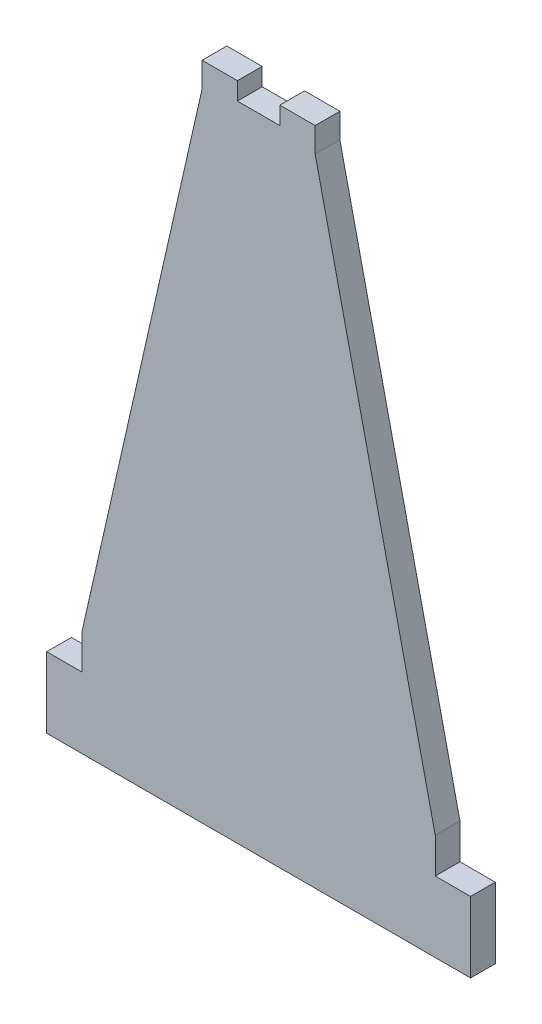
ISO-10303-21;
HEADER;
FILE_DESCRIPTION(('STEP AP214'),'2;1');
FILE_NAME('part.step','',(''),(''),'','','');
FILE_SCHEMA(('AUTOMOTIVE_DESIGN { 1 0 10303 214 1 1 1 1 }'));
ENDSEC;
DATA;
#1=APPLICATION_CONTEXT('core data for automotive mechanical design processes');
#2=APPLICATION_PROTOCOL_DEFINITION('international standard','automotive_design',2000,#1);
#3=PRODUCT_CONTEXT('',#1,'mechanical');
#4=PRODUCT('Part','Part','',(#3));
#5=PRODUCT_RELATED_PRODUCT_CATEGORY('part','',(#4));
#6=PRODUCT_DEFINITION_FORMATION('','',#4);
#7=PRODUCT_DEFINITION_CONTEXT('part definition',#1,'design');
#8=PRODUCT_DEFINITION('design','',#6,#7);
#9=PRODUCT_DEFINITION_SHAPE('','',#8);
#10=(LENGTH_UNIT() NAMED_UNIT(*) SI_UNIT(.MILLI.,.METRE.));
#11=(NAMED_UNIT(*) PLANE_ANGLE_UNIT() SI_UNIT($,.RADIAN.));
#12=(NAMED_UNIT(*) SI_UNIT($,.STERADIAN.) SOLID_ANGLE_UNIT());
#13=UNCERTAINTY_MEASURE_WITH_UNIT(LENGTH_MEASURE(1.E-05),#10,'distance_accuracy_value','');
#14=(GEOMETRIC_REPRESENTATION_CONTEXT(3) GLOBAL_UNCERTAINTY_ASSIGNED_CONTEXT((#13)) GLOBAL_UNIT_ASSIGNED_CONTEXT((#10,
#11,#12)) REPRESENTATION_CONTEXT('',''));
#15=CARTESIAN_POINT('',(0.,0.,0.));
#16=DIRECTION('',(0.,0.,1.));
#17=DIRECTION('',(1.,0.,0.));
#18=AXIS2_PLACEMENT_3D('',#15,#16,#17);
#19=CARTESIAN_POINT('',(0.,1.,0.175));
#20=DIRECTION('',(1.,0.,0.));
#21=DIRECTION('',(0.,1.,0.));
#22=AXIS2_PLACEMENT_3D('',#19,#20,#21);
#23=PLANE('',#22);
#24=DIRECTION('',(0.,-1.,0.));
#25=VECTOR('',#24,1.);
#26=CARTESIAN_POINT('',(0.,1.,-0.175));
#27=LINE('',#26,#25);
#28=CARTESIAN_POINT('',(0.,1.,-0.175));
#29=VERTEX_POINT('',#28);
#30=CARTESIAN_POINT('',(0.,0.,-0.175));
#31=VERTEX_POINT('',#30);
#32=EDGE_CURVE('E205',#29,#31,#27,.T.);
#33=ORIENTED_EDGE('',*,*,#32,.T.);
#34=DIRECTION('',(0.,0.,-1.));
#35=VECTOR('',#34,1.);
#36=CARTESIAN_POINT('',(0.,0.,0.175));
#37=LINE('',#36,#35);
#38=CARTESIAN_POINT('',(0.,0.,0.175));
#39=VERTEX_POINT('',#38);
#40=EDGE_CURVE('E11',#39,#31,#37,.T.);
#41=ORIENTED_EDGE('',*,*,#40,.F.);
#42=DIRECTION('',(0.,-1.,0.));
#43=VECTOR('',#42,1.);
#44=CARTESIAN_POINT('',(0.,1.,0.175));
#45=LINE('',#44,#43);
#46=CARTESIAN_POINT('',(0.,1.,0.175));
#47=VERTEX_POINT('',#46);
#48=EDGE_CURVE('E243',#47,#39,#45,.T.);
#49=ORIENTED_EDGE('',*,*,#48,.F.);
#50=DIRECTION('',(0.,0.,-1.));
#51=VECTOR('',#50,1.);
#52=CARTESIAN_POINT('',(0.,1.,0.175));
#53=LINE('',#52,#51);
#54=EDGE_CURVE('E201',#47,#29,#53,.T.);
#55=ORIENTED_EDGE('',*,*,#54,.T.);
#56=EDGE_LOOP('',(#33,#41,#49,#55));
#57=FACE_BOUND('',#56,.T.);
#58=ADVANCED_FACE('F39',(#57),#23,.F.);
#59=CARTESIAN_POINT('',(0.,0.,0.175));
#60=DIRECTION('',(0.,1.,0.));
#61=DIRECTION('',(0.,0.,1.));
#62=AXIS2_PLACEMENT_3D('',#59,#60,#61);
#63=PLANE('',#62);
#64=DIRECTION('',(1.,0.,0.));
#65=VECTOR('',#64,1.);
#66=CARTESIAN_POINT('',(0.,0.,-0.175));
#67=LINE('',#66,#65);
#68=CARTESIAN_POINT('',(6.,0.,-0.175));
#69=VERTEX_POINT('',#68);
#70=EDGE_CURVE('E209',#31,#69,#67,.T.);
#71=ORIENTED_EDGE('',*,*,#70,.T.);
#72=DIRECTION('',(0.,0.,-1.));
#73=VECTOR('',#72,1.);
#74=CARTESIAN_POINT('',(6.,0.,0.175));
#75=LINE('',#74,#73);
#76=CARTESIAN_POINT('',(6.,0.,0.175));
#77=VERTEX_POINT('',#76);
#78=EDGE_CURVE('E48',#77,#69,#75,.T.);
#79=ORIENTED_EDGE('',*,*,#78,.F.);
#80=DIRECTION('',(1.,0.,0.));
#81=VECTOR('',#80,1.);
#82=CARTESIAN_POINT('',(0.,0.,0.175));
#83=LINE('',#82,#81);
#84=EDGE_CURVE('E135',#39,#77,#83,.T.);
#85=ORIENTED_EDGE('',*,*,#84,.F.);
#86=ORIENTED_EDGE('',*,*,#40,.T.);
#87=EDGE_LOOP('',(#71,#79,#85,#86));
#88=FACE_BOUND('',#87,.T.);
#89=ADVANCED_FACE('F351',(#88),#63,.F.);
#90=CARTESIAN_POINT('',(6.,0.,0.175));
#91=DIRECTION('',(-1.,0.,0.));
#92=DIRECTION('',(0.,-1.,0.));
#93=AXIS2_PLACEMENT_3D('',#90,#91,#92);
#94=PLANE('',#93);
#95=DIRECTION('',(0.,1.,0.));
#96=VECTOR('',#95,1.);
#97=CARTESIAN_POINT('',(6.,0.,-0.175));
#98=LINE('',#97,#96);
#99=CARTESIAN_POINT('',(6.,1.,-0.175));
#100=VERTEX_POINT('',#99);
#101=EDGE_CURVE('E212',#69,#100,#98,.T.);
#102=ORIENTED_EDGE('',*,*,#101,.T.);
#103=DIRECTION('',(0.,0.,-1.));
#104=VECTOR('',#103,1.);
#105=CARTESIAN_POINT('',(6.,1.,0.175));
#106=LINE('',#105,#104);
#107=CARTESIAN_POINT('',(6.,1.,0.175));
#108=VERTEX_POINT('',#107);
#109=EDGE_CURVE('E278',#108,#100,#106,.T.);
#110=ORIENTED_EDGE('',*,*,#109,.F.);
#111=DIRECTION('',(0.,1.,0.));
#112=VECTOR('',#111,1.);
#113=CARTESIAN_POINT('',(6.,0.,0.175));
#114=LINE('',#113,#112);
#115=EDGE_CURVE('E289',#77,#108,#114,.T.);
#116=ORIENTED_EDGE('',*,*,#115,.F.);
#117=ORIENTED_EDGE('',*,*,#78,.T.);
#118=EDGE_LOOP('',(#102,#110,#116,#117));
#119=FACE_BOUND('',#118,.T.);
#120=ADVANCED_FACE('F287',(#119),#94,.F.);
#121=CARTESIAN_POINT('',(6.,1.,0.175));
#122=DIRECTION('',(0.,-1.,0.));
#123=DIRECTION('',(1.,0.,0.));
#124=AXIS2_PLACEMENT_3D('',#121,#122,#123);
#125=PLANE('',#124);
#126=DIRECTION('',(-1.,0.,0.));
#127=VECTOR('',#126,1.);
#128=CARTESIAN_POINT('',(6.,1.,-0.175));
#129=LINE('',#128,#127);
#130=CARTESIAN_POINT('',(5.5,1.,-0.175));
#131=VERTEX_POINT('',#130);
#132=EDGE_CURVE('E215',#100,#131,#129,.T.);
#133=ORIENTED_EDGE('',*,*,#132,.T.);
#134=DIRECTION('',(0.,0.,-1.));
#135=VECTOR('',#134,1.);
#136=CARTESIAN_POINT('',(5.5,1.,0.175));
#137=LINE('',#136,#135);
#138=CARTESIAN_POINT('',(5.5,1.,0.175));
#139=VERTEX_POINT('',#138);
#140=EDGE_CURVE('E274',#139,#131,#137,.T.);
#141=ORIENTED_EDGE('',*,*,#140,.F.);
#142=DIRECTION('',(-1.,0.,0.));
#143=VECTOR('',#142,1.);
#144=CARTESIAN_POINT('',(6.,1.,0.175));
#145=LINE('',#144,#143);
#146=EDGE_CURVE('E308',#108,#139,#145,.T.);
#147=ORIENTED_EDGE('',*,*,#146,.F.);
#148=ORIENTED_EDGE('',*,*,#109,.T.);
#149=EDGE_LOOP('',(#133,#141,#147,#148));
#150=FACE_BOUND('',#149,.T.);
#151=ADVANCED_FACE('F298',(#150),#125,.F.);
#152=CARTESIAN_POINT('',(5.5,1.,0.175));
#153=DIRECTION('',(-1.,0.,0.));
#154=DIRECTION('',(0.,-1.,0.));
#155=AXIS2_PLACEMENT_3D('',#152,#153,#154);
#156=PLANE('',#155);
#157=DIRECTION('',(0.,1.,0.));
#158=VECTOR('',#157,1.);
#159=CARTESIAN_POINT('',(5.5,1.,-0.175));
#160=LINE('',#159,#158);
#161=CARTESIAN_POINT('',(5.5,1.5,-0.175));
#162=VERTEX_POINT('',#161);
#163=EDGE_CURVE('E218',#131,#162,#160,.T.);
#164=ORIENTED_EDGE('',*,*,#163,.T.);
#165=DIRECTION('',(0.,0.,-1.));
#166=VECTOR('',#165,1.);
#167=CARTESIAN_POINT('',(5.5,1.5,0.175));
#168=LINE('',#167,#166);
#169=CARTESIAN_POINT('',(5.5,1.5,0.175));
#170=VERTEX_POINT('',#169);
#171=EDGE_CURVE('E270',#170,#162,#168,.T.);
#172=ORIENTED_EDGE('',*,*,#171,.F.);
#173=DIRECTION('',(0.,1.,0.));
#174=VECTOR('',#173,1.);
#175=CARTESIAN_POINT('',(5.5,1.,0.175));
#176=LINE('',#175,#174);
#177=EDGE_CURVE('E304',#139,#170,#176,.T.);
#178=ORIENTED_EDGE('',*,*,#177,.F.);
#179=ORIENTED_EDGE('',*,*,#140,.T.);
#180=EDGE_LOOP('',(#164,#172,#178,#179));
#181=FACE_BOUND('',#180,.T.);
#182=ADVANCED_FACE('F302',(#181),#156,.F.);
#183=CARTESIAN_POINT('',(5.5,1.5,0.175));
#184=DIRECTION('',(-0.97526042930658,-0.221059030642825,0.));
#185=DIRECTION('',(0.221059030642825,-0.97526042930658,0.));
#186=AXIS2_PLACEMENT_3D('',#183,#184,#185);
#187=PLANE('',#186);
#188=DIRECTION('',(-0.221059030642825,0.97526042930658,0.));
#189=VECTOR('',#188,1.);
#190=CARTESIAN_POINT('',(5.5,1.5,-0.175));
#191=LINE('',#190,#189);
#192=CARTESIAN_POINT('',(3.8,9.,-0.175));
#193=VERTEX_POINT('',#192);
#194=EDGE_CURVE('E221',#162,#193,#191,.T.);
#195=ORIENTED_EDGE('',*,*,#194,.T.);
#196=DIRECTION('',(0.,0.,-1.));
#197=VECTOR('',#196,1.);
#198=CARTESIAN_POINT('',(3.8,9.,0.175));
#199=LINE('',#198,#197);
#200=CARTESIAN_POINT('',(3.8,9.,0.175));
#201=VERTEX_POINT('',#200);
#202=EDGE_CURVE('E267',#201,#193,#199,.T.);
#203=ORIENTED_EDGE('',*,*,#202,.F.);
#204=DIRECTION('',(-0.221059030642825,0.97526042930658,0.));
#205=VECTOR('',#204,1.);
#206=CARTESIAN_POINT('',(5.5,1.5,0.175));
#207=LINE('',#206,#205);
#208=EDGE_CURVE('E307',#170,#201,#207,.T.);
#209=ORIENTED_EDGE('',*,*,#208,.F.);
#210=ORIENTED_EDGE('',*,*,#171,.T.);
#211=EDGE_LOOP('',(#195,#203,#209,#210));
#212=FACE_BOUND('',#211,.T.);
#213=ADVANCED_FACE('F364',(#212),#187,.F.);
#214=CARTESIAN_POINT('',(3.8,9.,0.175));
#215=DIRECTION('',(-1.,0.,0.));
#216=DIRECTION('',(0.,0.,1.));
#217=AXIS2_PLACEMENT_3D('',#214,#215,#216);
#218=PLANE('',#217);
#219=DIRECTION('',(0.,1.,0.));
#220=VECTOR('',#219,1.);
#221=CARTESIAN_POINT('',(3.8,9.,-0.175));
#222=LINE('',#221,#220);
#223=CARTESIAN_POINT('',(3.8,9.35,-0.175));
#224=VERTEX_POINT('',#223);
#225=EDGE_CURVE('E224',#193,#224,#222,.T.);
#226=ORIENTED_EDGE('',*,*,#225,.T.);
#227=DIRECTION('',(0.,0.,-1.));
#228=VECTOR('',#227,1.);
#229=CARTESIAN_POINT('',(3.8,9.35,0.175));
#230=LINE('',#229,#228);
#231=CARTESIAN_POINT('',(3.8,9.35,0.175));
#232=VERTEX_POINT('',#231);
#233=EDGE_CURVE('E264',#232,#224,#230,.T.);
#234=ORIENTED_EDGE('',*,*,#233,.F.);
#235=DIRECTION('',(0.,1.,0.));
#236=VECTOR('',#235,1.);
#237=CARTESIAN_POINT('',(3.8,9.,0.175));
#238=LINE('',#237,#236);
#239=EDGE_CURVE('E311',#201,#232,#238,.T.);
#240=ORIENTED_EDGE('',*,*,#239,.F.);
#241=ORIENTED_EDGE('',*,*,#202,.T.);
#242=EDGE_LOOP('',(#226,#234,#240,#241));
#243=FACE_BOUND('',#242,.T.);
#244=ADVANCED_FACE('F367',(#243),#218,.F.);
#245=CARTESIAN_POINT('',(3.8,9.35,0.175));
#246=DIRECTION('',(0.,-1.,0.));
#247=DIRECTION('',(0.,0.,-1.));
#248=AXIS2_PLACEMENT_3D('',#245,#246,#247);
#249=PLANE('',#248);
#250=DIRECTION('',(-1.,0.,0.));
#251=VECTOR('',#250,1.);
#252=CARTESIAN_POINT('',(3.8,9.35,-0.175));
#253=LINE('',#252,#251);
#254=CARTESIAN_POINT('',(3.3,9.35,-0.175));
#255=VERTEX_POINT('',#254);
#256=EDGE_CURVE('E226',#224,#255,#253,.T.);
#257=ORIENTED_EDGE('',*,*,#256,.T.);
#258=DIRECTION('',(0.,0.,-1.));
#259=VECTOR('',#258,1.);
#260=CARTESIAN_POINT('',(3.3,9.35,0.175));
#261=LINE('',#260,#259);
#262=CARTESIAN_POINT('',(3.3,9.35,0.175));
#263=VERTEX_POINT('',#262);
#264=EDGE_CURVE('E261',#263,#255,#261,.T.);
#265=ORIENTED_EDGE('',*,*,#264,.F.);
#266=DIRECTION('',(-1.,0.,0.));
#267=VECTOR('',#266,1.);
#268=CARTESIAN_POINT('',(3.8,9.35,0.175));
#269=LINE('',#268,#267);
#270=EDGE_CURVE('E318',#232,#263,#269,.T.);
#271=ORIENTED_EDGE('',*,*,#270,.F.);
#272=ORIENTED_EDGE('',*,*,#233,.T.);
#273=EDGE_LOOP('',(#257,#265,#271,#272));
#274=FACE_BOUND('',#273,.T.);
#275=ADVANCED_FACE('F371',(#274),#249,.F.);
#276=CARTESIAN_POINT('',(3.3,9.35,0.175));
#277=DIRECTION('',(1.,0.,0.));
#278=DIRECTION('',(0.,1.,0.));
#279=AXIS2_PLACEMENT_3D('',#276,#277,#278);
#280=PLANE('',#279);
#281=DIRECTION('',(0.,-1.,0.));
#282=VECTOR('',#281,1.);
#283=CARTESIAN_POINT('',(3.3,9.35,-0.175));
#284=LINE('',#283,#282);
#285=CARTESIAN_POINT('',(3.3,9.1,-0.175));
#286=VERTEX_POINT('',#285);
#287=EDGE_CURVE('E228',#255,#286,#284,.T.);
#288=ORIENTED_EDGE('',*,*,#287,.T.);
#289=DIRECTION('',(0.,0.,-1.));
#290=VECTOR('',#289,1.);
#291=CARTESIAN_POINT('',(3.3,9.1,0.175));
#292=LINE('',#291,#290);
#293=CARTESIAN_POINT('',(3.3,9.1,0.175));
#294=VERTEX_POINT('',#293);
#295=EDGE_CURVE('E258',#294,#286,#292,.T.);
#296=ORIENTED_EDGE('',*,*,#295,.F.);
#297=DIRECTION('',(0.,-1.,0.));
#298=VECTOR('',#297,1.);
#299=CARTESIAN_POINT('',(3.3,9.35,0.175));
#300=LINE('',#299,#298);
#301=EDGE_CURVE('E320',#263,#294,#300,.T.);
#302=ORIENTED_EDGE('',*,*,#301,.F.);
#303=ORIENTED_EDGE('',*,*,#264,.T.);
#304=EDGE_LOOP('',(#288,#296,#302,#303));
#305=FACE_BOUND('',#304,.T.);
#306=ADVANCED_FACE('F375',(#305),#280,.F.);
#307=CARTESIAN_POINT('',(3.3,9.1,0.175));
#308=DIRECTION('',(0.,-1.,0.));
#309=DIRECTION('',(0.,0.,-1.));
#310=AXIS2_PLACEMENT_3D('',#307,#308,#309);
#311=PLANE('',#310);
#312=DIRECTION('',(-1.,0.,0.));
#313=VECTOR('',#312,1.);
#314=CARTESIAN_POINT('',(3.3,9.1,-0.175));
#315=LINE('',#314,#313);
#316=CARTESIAN_POINT('',(2.7,9.1,-0.175));
#317=VERTEX_POINT('',#316);
#318=EDGE_CURVE('E230',#286,#317,#315,.T.);
#319=ORIENTED_EDGE('',*,*,#318,.T.);
#320=DIRECTION('',(0.,0.,-1.));
#321=VECTOR('',#320,1.);
#322=CARTESIAN_POINT('',(2.7,9.1,0.175));
#323=LINE('',#322,#321);
#324=CARTESIAN_POINT('',(2.7,9.1,0.175));
#325=VERTEX_POINT('',#324);
#326=EDGE_CURVE('E255',#325,#317,#323,.T.);
#327=ORIENTED_EDGE('',*,*,#326,.F.);
#328=DIRECTION('',(-1.,0.,0.));
#329=VECTOR('',#328,1.);
#330=CARTESIAN_POINT('',(3.3,9.1,0.175));
#331=LINE('',#330,#329);
#332=EDGE_CURVE('E322',#294,#325,#331,.T.);
#333=ORIENTED_EDGE('',*,*,#332,.F.);
#334=ORIENTED_EDGE('',*,*,#295,.T.);
#335=EDGE_LOOP('',(#319,#327,#333,#334));
#336=FACE_BOUND('',#335,.T.);
#337=ADVANCED_FACE('F379',(#336),#311,.F.);
#338=CARTESIAN_POINT('',(2.7,9.1,0.175));
#339=DIRECTION('',(-1.,0.,0.));
#340=DIRECTION('',(0.,0.,1.));
#341=AXIS2_PLACEMENT_3D('',#338,#339,#340);
#342=PLANE('',#341);
#343=DIRECTION('',(0.,1.,0.));
#344=VECTOR('',#343,1.);
#345=CARTESIAN_POINT('',(2.7,9.1,-0.175));
#346=LINE('',#345,#344);
#347=CARTESIAN_POINT('',(2.7,9.35,-0.175));
#348=VERTEX_POINT('',#347);
#349=EDGE_CURVE('E232',#317,#348,#346,.T.);
#350=ORIENTED_EDGE('',*,*,#349,.T.);
#351=DIRECTION('',(0.,0.,-1.));
#352=VECTOR('',#351,1.);
#353=CARTESIAN_POINT('',(2.7,9.35,0.175));
#354=LINE('',#353,#352);
#355=CARTESIAN_POINT('',(2.7,9.35,0.175));
#356=VERTEX_POINT('',#355);
#357=EDGE_CURVE('E252',#356,#348,#354,.T.);
#358=ORIENTED_EDGE('',*,*,#357,.F.);
#359=DIRECTION('',(0.,1.,0.));
#360=VECTOR('',#359,1.);
#361=CARTESIAN_POINT('',(2.7,9.1,0.175));
#362=LINE('',#361,#360);
#363=EDGE_CURVE('E324',#325,#356,#362,.T.);
#364=ORIENTED_EDGE('',*,*,#363,.F.);
#365=ORIENTED_EDGE('',*,*,#326,.T.);
#366=EDGE_LOOP('',(#350,#358,#364,#365));
#367=FACE_BOUND('',#366,.T.);
#368=ADVANCED_FACE('F383',(#367),#342,.F.);
#369=CARTESIAN_POINT('',(2.7,9.35,0.175));
#370=DIRECTION('',(0.,-1.,0.));
#371=DIRECTION('',(0.,0.,-1.));
#372=AXIS2_PLACEMENT_3D('',#369,#370,#371);
#373=PLANE('',#372);
#374=DIRECTION('',(-1.,0.,0.));
#375=VECTOR('',#374,1.);
#376=CARTESIAN_POINT('',(2.7,9.35,-0.175));
#377=LINE('',#376,#375);
#378=CARTESIAN_POINT('',(2.2,9.35,-0.175));
#379=VERTEX_POINT('',#378);
#380=EDGE_CURVE('E234',#348,#379,#377,.T.);
#381=ORIENTED_EDGE('',*,*,#380,.T.);
#382=DIRECTION('',(0.,0.,-1.));
#383=VECTOR('',#382,1.);
#384=CARTESIAN_POINT('',(2.2,9.35,0.175));
#385=LINE('',#384,#383);
#386=CARTESIAN_POINT('',(2.2,9.35,0.175));
#387=VERTEX_POINT('',#386);
#388=EDGE_CURVE('E249',#387,#379,#385,.T.);
#389=ORIENTED_EDGE('',*,*,#388,.F.);
#390=DIRECTION('',(-1.,0.,0.));
#391=VECTOR('',#390,1.);
#392=CARTESIAN_POINT('',(2.7,9.35,0.175));
#393=LINE('',#392,#391);
#394=EDGE_CURVE('E326',#356,#387,#393,.T.);
#395=ORIENTED_EDGE('',*,*,#394,.F.);
#396=ORIENTED_EDGE('',*,*,#357,.T.);
#397=EDGE_LOOP('',(#381,#389,#395,#396));
#398=FACE_BOUND('',#397,.T.);
#399=ADVANCED_FACE('F332',(#398),#373,.F.);
#400=CARTESIAN_POINT('',(2.2,9.35,0.175));
#401=DIRECTION('',(1.,0.,0.));
#402=DIRECTION('',(0.,0.,-1.));
#403=AXIS2_PLACEMENT_3D('',#400,#401,#402);
#404=PLANE('',#403);
#405=DIRECTION('',(0.,-1.,0.));
#406=VECTOR('',#405,1.);
#407=CARTESIAN_POINT('',(2.2,9.35,-0.175));
#408=LINE('',#407,#406);
#409=CARTESIAN_POINT('',(2.2,9.,-0.175));
#410=VERTEX_POINT('',#409);
#411=EDGE_CURVE('E236',#379,#410,#408,.T.);
#412=ORIENTED_EDGE('',*,*,#411,.T.);
#413=DIRECTION('',(0.,0.,-1.));
#414=VECTOR('',#413,1.);
#415=CARTESIAN_POINT('',(2.2,9.,0.175));
#416=LINE('',#415,#414);
#417=CARTESIAN_POINT('',(2.2,9.,0.175));
#418=VERTEX_POINT('',#417);
#419=EDGE_CURVE('E193',#418,#410,#416,.T.);
#420=ORIENTED_EDGE('',*,*,#419,.F.);
#421=DIRECTION('',(0.,-1.,0.));
#422=VECTOR('',#421,1.);
#423=CARTESIAN_POINT('',(2.2,9.35,0.175));
#424=LINE('',#423,#422);
#425=EDGE_CURVE('E182',#387,#418,#424,.T.);
#426=ORIENTED_EDGE('',*,*,#425,.F.);
#427=ORIENTED_EDGE('',*,*,#388,.T.);
#428=EDGE_LOOP('',(#412,#420,#426,#427));
#429=FACE_BOUND('',#428,.T.);
#430=ADVANCED_FACE('F336',(#429),#404,.F.);
#431=CARTESIAN_POINT('',(2.2,9.,0.175));
#432=DIRECTION('',(0.97526042930658,-0.221059030642825,0.));
#433=DIRECTION('',(0.221059030642825,0.97526042930658,0.));
#434=AXIS2_PLACEMENT_3D('',#431,#432,#433);
#435=PLANE('',#434);
#436=DIRECTION('',(-0.221059030642825,-0.97526042930658,0.));
#437=VECTOR('',#436,1.);
#438=CARTESIAN_POINT('',(2.2,9.,-0.175));
#439=LINE('',#438,#437);
#440=CARTESIAN_POINT('',(0.5,1.5,-0.175));
#441=VERTEX_POINT('',#440);
#442=EDGE_CURVE('E191',#410,#441,#439,.T.);
#443=ORIENTED_EDGE('',*,*,#442,.T.);
#444=DIRECTION('',(0.,0.,-1.));
#445=VECTOR('',#444,1.);
#446=CARTESIAN_POINT('',(0.5,1.5,0.175));
#447=LINE('',#446,#445);
#448=CARTESIAN_POINT('',(0.5,1.5,0.175));
#449=VERTEX_POINT('',#448);
#450=EDGE_CURVE('E188',#449,#441,#447,.T.);
#451=ORIENTED_EDGE('',*,*,#450,.F.);
#452=DIRECTION('',(-0.221059030642825,-0.97526042930658,0.));
#453=VECTOR('',#452,1.);
#454=CARTESIAN_POINT('',(2.2,9.,0.175));
#455=LINE('',#454,#453);
#456=EDGE_CURVE('E176',#418,#449,#455,.T.);
#457=ORIENTED_EDGE('',*,*,#456,.F.);
#458=ORIENTED_EDGE('',*,*,#419,.T.);
#459=EDGE_LOOP('',(#443,#451,#457,#458));
#460=FACE_BOUND('',#459,.T.);
#461=ADVANCED_FACE('F189',(#460),#435,.F.);
#462=CARTESIAN_POINT('',(0.5,1.5,0.175));
#463=DIRECTION('',(1.,0.,0.));
#464=DIRECTION('',(0.,1.,0.));
#465=AXIS2_PLACEMENT_3D('',#462,#463,#464);
#466=PLANE('',#465);
#467=DIRECTION('',(0.,-1.,0.));
#468=VECTOR('',#467,1.);
#469=CARTESIAN_POINT('',(0.5,1.5,-0.175));
#470=LINE('',#469,#468);
#471=CARTESIAN_POINT('',(0.5,1.,-0.175));
#472=VERTEX_POINT('',#471);
#473=EDGE_CURVE('E119',#441,#472,#470,.T.);
#474=ORIENTED_EDGE('',*,*,#473,.T.);
#475=DIRECTION('',(0.,0.,-1.));
#476=VECTOR('',#475,1.);
#477=CARTESIAN_POINT('',(0.5,1.,0.175));
#478=LINE('',#477,#476);
#479=CARTESIAN_POINT('',(0.5,1.,0.175));
#480=VERTEX_POINT('',#479);
#481=EDGE_CURVE('E194',#480,#472,#478,.T.);
#482=ORIENTED_EDGE('',*,*,#481,.F.);
#483=DIRECTION('',(0.,-1.,0.));
#484=VECTOR('',#483,1.);
#485=CARTESIAN_POINT('',(0.5,1.5,0.175));
#486=LINE('',#485,#484);
#487=EDGE_CURVE('E180',#449,#480,#486,.T.);
#488=ORIENTED_EDGE('',*,*,#487,.F.);
#489=ORIENTED_EDGE('',*,*,#450,.T.);
#490=EDGE_LOOP('',(#474,#482,#488,#489));
#491=FACE_BOUND('',#490,.T.);
#492=ADVANCED_FACE('F196',(#491),#466,.F.);
#493=CARTESIAN_POINT('',(0.5,1.,0.175));
#494=DIRECTION('',(0.,-1.,0.));
#495=DIRECTION('',(1.,0.,0.));
#496=AXIS2_PLACEMENT_3D('',#493,#494,#495);
#497=PLANE('',#496);
#498=DIRECTION('',(-1.,0.,0.));
#499=VECTOR('',#498,1.);
#500=CARTESIAN_POINT('',(0.5,1.,-0.175));
#501=LINE('',#500,#499);
#502=EDGE_CURVE('E126',#472,#29,#501,.T.);
#503=ORIENTED_EDGE('',*,*,#502,.T.);
#504=ORIENTED_EDGE('',*,*,#54,.F.);
#505=DIRECTION('',(-1.,0.,0.));
#506=VECTOR('',#505,1.);
#507=CARTESIAN_POINT('',(0.5,1.,0.175));
#508=LINE('',#507,#506);
#509=EDGE_CURVE('E59',#480,#47,#508,.T.);
#510=ORIENTED_EDGE('',*,*,#509,.F.);
#511=ORIENTED_EDGE('',*,*,#481,.T.);
#512=EDGE_LOOP('',(#503,#504,#510,#511));
#513=FACE_BOUND('',#512,.T.);
#514=ADVANCED_FACE('F340',(#513),#497,.F.);
#515=CARTESIAN_POINT('',(0.,0.,0.175));
#516=DIRECTION('',(0.,0.,1.));
#517=DIRECTION('',(1.,0.,0.));
#518=AXIS2_PLACEMENT_3D('',#515,#516,#517);
#519=PLANE('',#518);
#520=ORIENTED_EDGE('',*,*,#48,.T.);
#521=ORIENTED_EDGE('',*,*,#84,.T.);
#522=ORIENTED_EDGE('',*,*,#115,.T.);
#523=ORIENTED_EDGE('',*,*,#146,.T.);
#524=ORIENTED_EDGE('',*,*,#177,.T.);
#525=ORIENTED_EDGE('',*,*,#208,.T.);
#526=ORIENTED_EDGE('',*,*,#239,.T.);
#527=ORIENTED_EDGE('',*,*,#270,.T.);
#528=ORIENTED_EDGE('',*,*,#301,.T.);
#529=ORIENTED_EDGE('',*,*,#332,.T.);
#530=ORIENTED_EDGE('',*,*,#363,.T.);
#531=ORIENTED_EDGE('',*,*,#394,.T.);
#532=ORIENTED_EDGE('',*,*,#425,.T.);
#533=ORIENTED_EDGE('',*,*,#456,.T.);
#534=ORIENTED_EDGE('',*,*,#487,.T.);
#535=ORIENTED_EDGE('',*,*,#509,.T.);
#536=EDGE_LOOP('',(#520,#521,#522,#523,#524,#525,#526,#527,#528,#529,#530,#531,#532,#533,#534,#535));
#537=FACE_BOUND('',#536,.T.);
#538=ADVANCED_FACE('F178',(#537),#519,.T.);
#539=CARTESIAN_POINT('',(0.,0.,-0.175));
#540=DIRECTION('',(0.,0.,1.));
#541=DIRECTION('',(1.,0.,0.));
#542=AXIS2_PLACEMENT_3D('',#539,#540,#541);
#543=PLANE('',#542);
#544=ORIENTED_EDGE('',*,*,#32,.F.);
#545=ORIENTED_EDGE('',*,*,#502,.F.);
#546=ORIENTED_EDGE('',*,*,#473,.F.);
#547=ORIENTED_EDGE('',*,*,#442,.F.);
#548=ORIENTED_EDGE('',*,*,#411,.F.);
#549=ORIENTED_EDGE('',*,*,#380,.F.);
#550=ORIENTED_EDGE('',*,*,#349,.F.);
#551=ORIENTED_EDGE('',*,*,#318,.F.);
#552=ORIENTED_EDGE('',*,*,#287,.F.);
#553=ORIENTED_EDGE('',*,*,#256,.F.);
#554=ORIENTED_EDGE('',*,*,#225,.F.);
#555=ORIENTED_EDGE('',*,*,#194,.F.);
#556=ORIENTED_EDGE('',*,*,#163,.F.);
#557=ORIENTED_EDGE('',*,*,#132,.F.);
#558=ORIENTED_EDGE('',*,*,#101,.F.);
#559=ORIENTED_EDGE('',*,*,#70,.F.);
#560=EDGE_LOOP('',(#544,#545,#546,#547,#548,#549,#550,#551,#552,#553,#554,#555,#556,#557,#558,#559));
#561=FACE_BOUND('',#560,.T.);
#562=ADVANCED_FACE('F293',(#561),#543,.F.);
#563=CLOSED_SHELL('',(#58,#89,#120,#151,#182,#213,#244,#275,#306,#337,#368,#399,#430,#461,#492,
#514,#538,#562));
#564=MANIFOLD_SOLID_BREP('B2',#563);
#565=ADVANCED_BREP_SHAPE_REPRESENTATION('',(#18,#564),#14);
#566=SHAPE_DEFINITION_REPRESENTATION(#9,#565);
ENDSEC;
END-ISO-10303-21;
